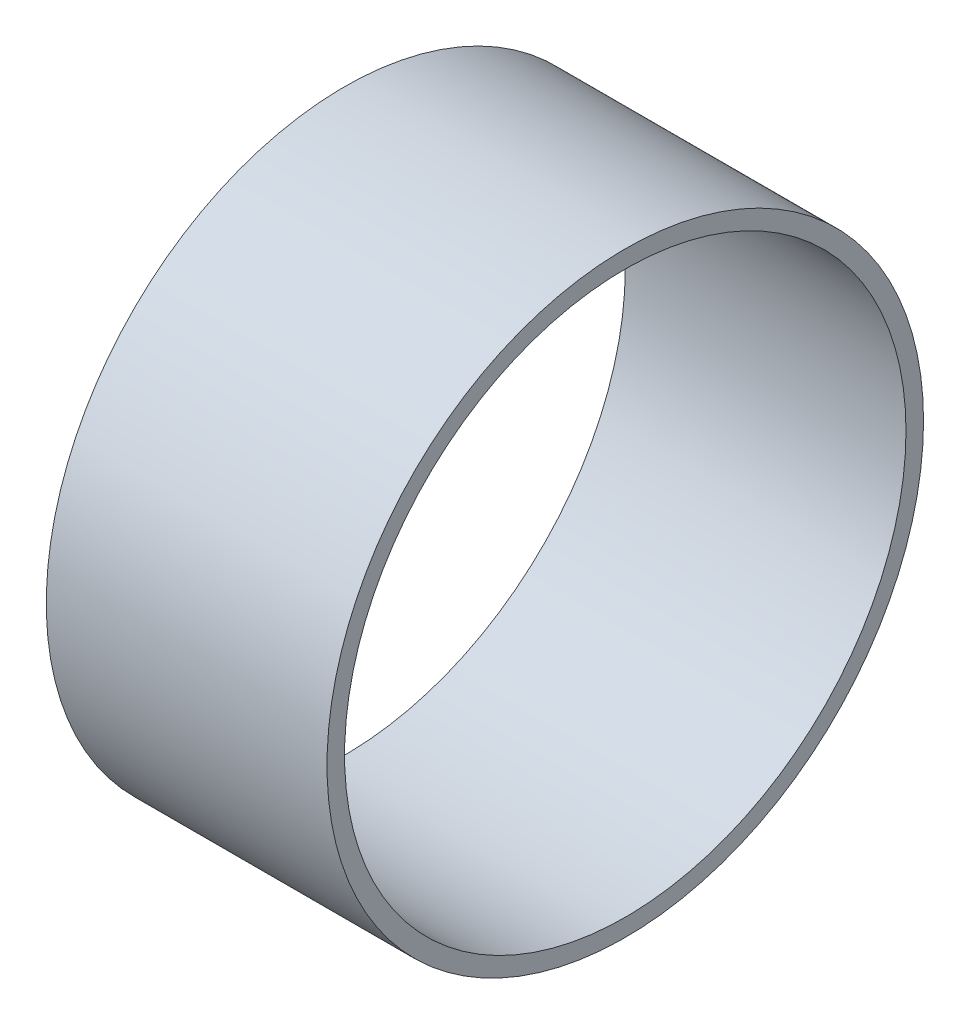
ISO-10303-21;
HEADER;
FILE_DESCRIPTION(('STEP AP214'),'2;1');
FILE_NAME('part.step','',(''),(''),'','','');
FILE_SCHEMA(('AUTOMOTIVE_DESIGN { 1 0 10303 214 1 1 1 1 }'));
ENDSEC;
DATA;
#1=APPLICATION_CONTEXT('core data for automotive mechanical design processes');
#2=APPLICATION_PROTOCOL_DEFINITION('international standard','automotive_design',2000,#1);
#3=PRODUCT_CONTEXT('',#1,'mechanical');
#4=PRODUCT('Part','Part','',(#3));
#5=PRODUCT_RELATED_PRODUCT_CATEGORY('part','',(#4));
#6=PRODUCT_DEFINITION_FORMATION('','',#4);
#7=PRODUCT_DEFINITION_CONTEXT('part definition',#1,'design');
#8=PRODUCT_DEFINITION('design','',#6,#7);
#9=PRODUCT_DEFINITION_SHAPE('','',#8);
#10=(LENGTH_UNIT() NAMED_UNIT(*) SI_UNIT(.MILLI.,.METRE.));
#11=(NAMED_UNIT(*) PLANE_ANGLE_UNIT() SI_UNIT($,.RADIAN.));
#12=(NAMED_UNIT(*) SI_UNIT($,.STERADIAN.) SOLID_ANGLE_UNIT());
#13=UNCERTAINTY_MEASURE_WITH_UNIT(LENGTH_MEASURE(1.E-05),#10,'distance_accuracy_value','');
#14=(GEOMETRIC_REPRESENTATION_CONTEXT(3) GLOBAL_UNCERTAINTY_ASSIGNED_CONTEXT((#13)) GLOBAL_UNIT_ASSIGNED_CONTEXT((#10,
#11,#12)) REPRESENTATION_CONTEXT('',''));
#15=CARTESIAN_POINT('',(0.,0.,0.));
#16=DIRECTION('',(0.,0.,1.));
#17=DIRECTION('',(1.,0.,0.));
#18=AXIS2_PLACEMENT_3D('',#15,#16,#17);
#19=CARTESIAN_POINT('',(152.4,0.,0.));
#20=DIRECTION('',(-1.,0.,0.));
#21=DIRECTION('',(0.,0.,1.));
#22=AXIS2_PLACEMENT_3D('',#19,#20,#21);
#23=CYLINDRICAL_SURFACE('',#22,152.4);
#24=CARTESIAN_POINT('',(152.4,0.,0.));
#25=DIRECTION('',(1.,0.,0.));
#26=DIRECTION('',(0.,0.,-1.));
#27=AXIS2_PLACEMENT_3D('',#24,#25,#26);
#28=CIRCLE('',#27,152.4);
#29=CARTESIAN_POINT('',(152.4,0.,-152.4));
#30=VERTEX_POINT('',#29);
#31=EDGE_CURVE('E9',#30,#30,#28,.T.);
#32=ORIENTED_EDGE('',*,*,#31,.T.);
#33=EDGE_LOOP('',(#32));
#34=FACE_BOUND('',#33,.T.);
#35=CARTESIAN_POINT('',(0.,0.,0.));
#36=DIRECTION('',(1.,0.,0.));
#37=DIRECTION('',(0.,0.,-1.));
#38=AXIS2_PLACEMENT_3D('',#35,#36,#37);
#39=CIRCLE('',#38,152.4);
#40=CARTESIAN_POINT('',(0.,0.,-152.4));
#41=VERTEX_POINT('',#40);
#42=EDGE_CURVE('E28',#41,#41,#39,.T.);
#43=ORIENTED_EDGE('',*,*,#42,.F.);
#44=EDGE_LOOP('',(#43));
#45=FACE_BOUND('',#44,.T.);
#46=ADVANCED_FACE('F14',(#34,#45),#23,.F.);
#47=CARTESIAN_POINT('',(152.4,0.,0.));
#48=DIRECTION('',(-1.,0.,0.));
#49=DIRECTION('',(0.,0.,1.));
#50=AXIS2_PLACEMENT_3D('',#47,#48,#49);
#51=CYLINDRICAL_SURFACE('',#50,161.925);
#52=CARTESIAN_POINT('',(152.4,0.,0.));
#53=DIRECTION('',(1.,0.,0.));
#54=DIRECTION('',(0.,0.,-1.));
#55=AXIS2_PLACEMENT_3D('',#52,#53,#54);
#56=CIRCLE('',#55,161.925);
#57=CARTESIAN_POINT('',(152.4,0.,-161.925));
#58=VERTEX_POINT('',#57);
#59=EDGE_CURVE('E26',#58,#58,#56,.T.);
#60=ORIENTED_EDGE('',*,*,#59,.F.);
#61=EDGE_LOOP('',(#60));
#62=FACE_BOUND('',#61,.T.);
#63=CARTESIAN_POINT('',(0.,0.,0.));
#64=DIRECTION('',(1.,0.,0.));
#65=DIRECTION('',(0.,0.,-1.));
#66=AXIS2_PLACEMENT_3D('',#63,#64,#65);
#67=CIRCLE('',#66,161.925);
#68=CARTESIAN_POINT('',(0.,0.,-161.925));
#69=VERTEX_POINT('',#68);
#70=EDGE_CURVE('E18',#69,#69,#67,.T.);
#71=ORIENTED_EDGE('',*,*,#70,.T.);
#72=EDGE_LOOP('',(#71));
#73=FACE_BOUND('',#72,.T.);
#74=ADVANCED_FACE('F35',(#62,#73),#51,.T.);
#75=CARTESIAN_POINT('',(152.4,0.,0.));
#76=DIRECTION('',(1.,0.,0.));
#77=DIRECTION('',(0.,0.,-1.));
#78=AXIS2_PLACEMENT_3D('',#75,#76,#77);
#79=PLANE('',#78);
#80=ORIENTED_EDGE('',*,*,#31,.F.);
#81=EDGE_LOOP('',(#80));
#82=FACE_BOUND('',#81,.T.);
#83=ORIENTED_EDGE('',*,*,#59,.T.);
#84=EDGE_LOOP('',(#83));
#85=FACE_BOUND('',#84,.T.);
#86=ADVANCED_FACE('F33',(#82,#85),#79,.T.);
#87=CARTESIAN_POINT('',(0.,0.,0.));
#88=DIRECTION('',(1.,0.,0.));
#89=DIRECTION('',(0.,0.,-1.));
#90=AXIS2_PLACEMENT_3D('',#87,#88,#89);
#91=PLANE('',#90);
#92=ORIENTED_EDGE('',*,*,#42,.T.);
#93=EDGE_LOOP('',(#92));
#94=FACE_BOUND('',#93,.T.);
#95=ORIENTED_EDGE('',*,*,#70,.F.);
#96=EDGE_LOOP('',(#95));
#97=FACE_BOUND('',#96,.T.);
#98=ADVANCED_FACE('F16',(#94,#97),#91,.F.);
#99=CLOSED_SHELL('',(#46,#74,#86,#98));
#100=MANIFOLD_SOLID_BREP('B1',#99);
#101=ADVANCED_BREP_SHAPE_REPRESENTATION('',(#18,#100),#14);
#102=SHAPE_DEFINITION_REPRESENTATION(#9,#101);
ENDSEC;
END-ISO-10303-21;
